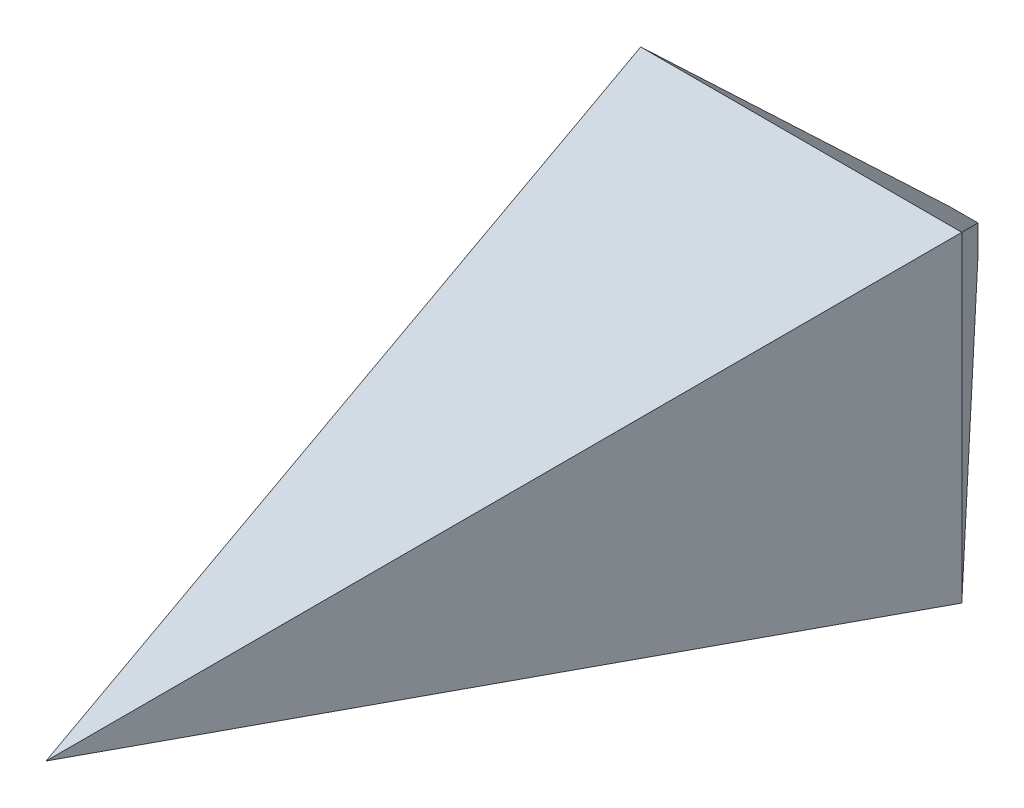
ISO-10303-21;
HEADER;
FILE_DESCRIPTION(('STEP AP214'),'2;1');
FILE_NAME('part.step','',(''),(''),'','','');
FILE_SCHEMA(('AUTOMOTIVE_DESIGN { 1 0 10303 214 1 1 1 1 }'));
ENDSEC;
DATA;
#1=APPLICATION_CONTEXT('core data for automotive mechanical design processes');
#2=APPLICATION_PROTOCOL_DEFINITION('international standard','automotive_design',2000,#1);
#3=PRODUCT_CONTEXT('',#1,'mechanical');
#4=PRODUCT('Part','Part','',(#3));
#5=PRODUCT_RELATED_PRODUCT_CATEGORY('part','',(#4));
#6=PRODUCT_DEFINITION_FORMATION('','',#4);
#7=PRODUCT_DEFINITION_CONTEXT('part definition',#1,'design');
#8=PRODUCT_DEFINITION('design','',#6,#7);
#9=PRODUCT_DEFINITION_SHAPE('','',#8);
#10=(LENGTH_UNIT() NAMED_UNIT(*) SI_UNIT(.MILLI.,.METRE.));
#11=(NAMED_UNIT(*) PLANE_ANGLE_UNIT() SI_UNIT($,.RADIAN.));
#12=(NAMED_UNIT(*) SI_UNIT($,.STERADIAN.) SOLID_ANGLE_UNIT());
#13=UNCERTAINTY_MEASURE_WITH_UNIT(LENGTH_MEASURE(1.E-05),#10,'distance_accuracy_value','');
#14=(GEOMETRIC_REPRESENTATION_CONTEXT(3) GLOBAL_UNCERTAINTY_ASSIGNED_CONTEXT((#13)) GLOBAL_UNIT_ASSIGNED_CONTEXT((#10,
#11,#12)) REPRESENTATION_CONTEXT('',''));
#15=CARTESIAN_POINT('',(0.,0.,0.));
#16=DIRECTION('',(0.,0.,1.));
#17=DIRECTION('',(1.,0.,0.));
#18=AXIS2_PLACEMENT_3D('',#15,#16,#17);
#19=CARTESIAN_POINT('',(37.5,37.5,0.));
#20=DIRECTION('',(0.978147600733806,0.,0.20791169081776));
#21=DIRECTION('',(0.20791169081776,0.,-0.978147600733806));
#22=AXIS2_PLACEMENT_3D('',#19,#20,#21);
#23=PLANE('',#22);
#24=DIRECTION('',(0.203558594952779,0.203558594952779,-0.957667894857973));
#25=VECTOR('',#24,1.);
#26=CARTESIAN_POINT('',(37.5,37.5,0.));
#27=LINE('',#26,#25);
#28=CARTESIAN_POINT('',(0.,0.,176.423629105442));
#29=VERTEX_POINT('',#28);
#30=CARTESIAN_POINT('',(37.5,37.5,0.));
#31=VERTEX_POINT('',#30);
#32=EDGE_CURVE('E11',#29,#31,#27,.T.);
#33=ORIENTED_EDGE('',*,*,#32,.F.);
#34=DIRECTION('',(0.203558594952779,-0.203558594952779,-0.957667894857973));
#35=VECTOR('',#34,1.);
#36=CARTESIAN_POINT('',(34.3922923815638,-34.3922923815638,14.6206148331506));
#37=LINE('',#36,#35);
#38=CARTESIAN_POINT('',(37.5,-37.5,0.));
#39=VERTEX_POINT('',#38);
#40=EDGE_CURVE('E97',#29,#39,#37,.T.);
#41=ORIENTED_EDGE('',*,*,#40,.T.);
#42=DIRECTION('',(0.,1.,0.));
#43=VECTOR('',#42,1.);
#44=CARTESIAN_POINT('',(37.5,37.5,0.));
#45=LINE('',#44,#43);
#46=EDGE_CURVE('E107',#39,#31,#45,.T.);
#47=ORIENTED_EDGE('',*,*,#46,.T.);
#48=EDGE_LOOP('',(#33,#41,#47));
#49=FACE_BOUND('',#48,.T.);
#50=ADVANCED_FACE('F36',(#49),#23,.T.);
#51=CARTESIAN_POINT('',(37.5,37.5,0.));
#52=DIRECTION('',(0.,0.978147600733806,0.20791169081776));
#53=DIRECTION('',(0.,-0.20791169081776,0.978147600733806));
#54=AXIS2_PLACEMENT_3D('',#51,#52,#53);
#55=PLANE('',#54);
#56=DIRECTION('',(-0.203558594952779,0.203558594952779,-0.957667894857973));
#57=VECTOR('',#56,1.);
#58=CARTESIAN_POINT('',(-37.5,37.5,0.));
#59=LINE('',#58,#57);
#60=CARTESIAN_POINT('',(-37.5,37.5,0.));
#61=VERTEX_POINT('',#60);
#62=EDGE_CURVE('E40',#29,#61,#59,.T.);
#63=ORIENTED_EDGE('',*,*,#62,.F.);
#64=ORIENTED_EDGE('',*,*,#32,.T.);
#65=DIRECTION('',(-1.,0.,0.));
#66=VECTOR('',#65,1.);
#67=CARTESIAN_POINT('',(37.5,37.5,0.));
#68=LINE('',#67,#66);
#69=EDGE_CURVE('E105',#31,#61,#68,.T.);
#70=ORIENTED_EDGE('',*,*,#69,.T.);
#71=EDGE_LOOP('',(#63,#64,#70));
#72=FACE_BOUND('',#71,.T.);
#73=ADVANCED_FACE('F38',(#72),#55,.T.);
#74=CARTESIAN_POINT('',(-37.5,37.5,0.));
#75=DIRECTION('',(-0.978147600733806,0.,0.20791169081776));
#76=DIRECTION('',(0.20791169081776,0.,0.978147600733806));
#77=AXIS2_PLACEMENT_3D('',#74,#75,#76);
#78=PLANE('',#77);
#79=DIRECTION('',(-0.203558594952779,-0.203558594952779,-0.957667894857973));
#80=VECTOR('',#79,1.);
#81=CARTESIAN_POINT('',(-34.3922923815638,-34.3922923815638,14.6206148331506));
#82=LINE('',#81,#80);
#83=CARTESIAN_POINT('',(-37.5,-37.5,0.));
#84=VERTEX_POINT('',#83);
#85=EDGE_CURVE('E99',#29,#84,#82,.T.);
#86=ORIENTED_EDGE('',*,*,#85,.F.);
#87=ORIENTED_EDGE('',*,*,#62,.T.);
#88=DIRECTION('',(0.,-1.,0.));
#89=VECTOR('',#88,1.);
#90=CARTESIAN_POINT('',(-37.5,37.5,0.));
#91=LINE('',#90,#89);
#92=EDGE_CURVE('E58',#61,#84,#91,.T.);
#93=ORIENTED_EDGE('',*,*,#92,.T.);
#94=EDGE_LOOP('',(#86,#87,#93));
#95=FACE_BOUND('',#94,.T.);
#96=ADVANCED_FACE('F104',(#95),#78,.T.);
#97=CARTESIAN_POINT('',(37.5,-37.5,0.));
#98=DIRECTION('',(0.,-0.978147600733806,0.20791169081776));
#99=DIRECTION('',(0.,-0.20791169081776,-0.978147600733806));
#100=AXIS2_PLACEMENT_3D('',#97,#98,#99);
#101=PLANE('',#100);
#102=ORIENTED_EDGE('',*,*,#40,.F.);
#103=ORIENTED_EDGE('',*,*,#85,.T.);
#104=DIRECTION('',(1.,0.,0.));
#105=VECTOR('',#104,1.);
#106=CARTESIAN_POINT('',(37.5,-37.5,0.));
#107=LINE('',#106,#105);
#108=EDGE_CURVE('E91',#84,#39,#107,.T.);
#109=ORIENTED_EDGE('',*,*,#108,.T.);
#110=EDGE_LOOP('',(#102,#103,#109));
#111=FACE_BOUND('',#110,.T.);
#112=ADVANCED_FACE('F100',(#111),#101,.T.);
#113=CARTESIAN_POINT('',(37.5,37.5,0.));
#114=DIRECTION('',(0.,0.743144825477393,-0.669130606358859));
#115=DIRECTION('',(0.,0.669130606358859,0.743144825477394));
#116=AXIS2_PLACEMENT_3D('',#113,#114,#115);
#117=PLANE('',#116);
#118=ORIENTED_EDGE('',*,*,#69,.F.);
#119=DIRECTION('',(0.556117091816005,0.556117091816005,0.617630601881269));
#120=VECTOR('',#119,1.);
#121=CARTESIAN_POINT('',(14.3050335142582,14.3050335142582,-25.7606200601085));
#122=LINE('',#121,#120);
#123=CARTESIAN_POINT('',(3.28464631668198,3.28464631668198,-38.));
#124=VERTEX_POINT('',#123);
#125=EDGE_CURVE('E117',#124,#31,#122,.T.);
#126=ORIENTED_EDGE('',*,*,#125,.F.);
#127=DIRECTION('',(-1.,0.,0.));
#128=VECTOR('',#127,1.);
#129=CARTESIAN_POINT('',(37.5,3.28464631668199,-38.));
#130=LINE('',#129,#128);
#131=CARTESIAN_POINT('',(-3.28464631668201,3.28464631668197,-38.));
#132=VERTEX_POINT('',#131);
#133=EDGE_CURVE('E119',#124,#132,#130,.T.);
#134=ORIENTED_EDGE('',*,*,#133,.T.);
#135=DIRECTION('',(-0.556117091816005,0.556117091816005,0.617630601881269));
#136=VECTOR('',#135,1.);
#137=CARTESIAN_POINT('',(-14.3050335142582,14.3050335142582,-25.7606200601085));
#138=LINE('',#137,#136);
#139=EDGE_CURVE('E88',#132,#61,#138,.T.);
#140=ORIENTED_EDGE('',*,*,#139,.T.);
#141=EDGE_LOOP('',(#118,#126,#134,#140));
#142=FACE_BOUND('',#141,.T.);
#143=ADVANCED_FACE('F115',(#142),#117,.T.);
#144=CARTESIAN_POINT('',(37.5,-37.5,0.));
#145=DIRECTION('',(0.743144825477393,0.,-0.669130606358859));
#146=DIRECTION('',(-0.669130606358859,0.,-0.743144825477394));
#147=AXIS2_PLACEMENT_3D('',#144,#145,#146);
#148=PLANE('',#147);
#149=ORIENTED_EDGE('',*,*,#46,.F.);
#150=DIRECTION('',(0.556117091816005,-0.556117091816005,0.617630601881269));
#151=VECTOR('',#150,1.);
#152=CARTESIAN_POINT('',(14.3050335142582,-14.3050335142582,-25.7606200601085));
#153=LINE('',#152,#151);
#154=CARTESIAN_POINT('',(3.28464631668199,-3.284646316682,-38.));
#155=VERTEX_POINT('',#154);
#156=EDGE_CURVE('E87',#155,#39,#153,.T.);
#157=ORIENTED_EDGE('',*,*,#156,.F.);
#158=DIRECTION('',(0.,1.,0.));
#159=VECTOR('',#158,1.);
#160=CARTESIAN_POINT('',(3.284646316682,-37.5,-38.));
#161=LINE('',#160,#159);
#162=EDGE_CURVE('E120',#155,#124,#161,.T.);
#163=ORIENTED_EDGE('',*,*,#162,.T.);
#164=ORIENTED_EDGE('',*,*,#125,.T.);
#165=EDGE_LOOP('',(#149,#157,#163,#164));
#166=FACE_BOUND('',#165,.T.);
#167=ADVANCED_FACE('F131',(#166),#148,.T.);
#168=CARTESIAN_POINT('',(-37.5,-37.5,0.));
#169=DIRECTION('',(0.,-0.743144825477393,-0.669130606358859));
#170=DIRECTION('',(0.,0.669130606358859,-0.743144825477394));
#171=AXIS2_PLACEMENT_3D('',#168,#169,#170);
#172=PLANE('',#171);
#173=ORIENTED_EDGE('',*,*,#108,.F.);
#174=DIRECTION('',(-0.556117091816005,-0.556117091816005,0.617630601881269));
#175=VECTOR('',#174,1.);
#176=CARTESIAN_POINT('',(-14.3050335142582,-14.3050335142582,-25.7606200601085));
#177=LINE('',#176,#175);
#178=CARTESIAN_POINT('',(-3.28464631668201,-3.284646316682,-38.));
#179=VERTEX_POINT('',#178);
#180=EDGE_CURVE('E79',#179,#84,#177,.T.);
#181=ORIENTED_EDGE('',*,*,#180,.F.);
#182=DIRECTION('',(1.,0.,0.));
#183=VECTOR('',#182,1.);
#184=CARTESIAN_POINT('',(-37.5,-3.28464631668201,-38.));
#185=LINE('',#184,#183);
#186=EDGE_CURVE('E123',#179,#155,#185,.T.);
#187=ORIENTED_EDGE('',*,*,#186,.T.);
#188=ORIENTED_EDGE('',*,*,#156,.T.);
#189=EDGE_LOOP('',(#173,#181,#187,#188));
#190=FACE_BOUND('',#189,.T.);
#191=ADVANCED_FACE('F93',(#190),#172,.T.);
#192=CARTESIAN_POINT('',(-37.5,37.5,0.));
#193=DIRECTION('',(-0.743144825477393,0.,-0.669130606358859));
#194=DIRECTION('',(-0.669130606358859,0.,0.743144825477394));
#195=AXIS2_PLACEMENT_3D('',#192,#193,#194);
#196=PLANE('',#195);
#197=ORIENTED_EDGE('',*,*,#92,.F.);
#198=ORIENTED_EDGE('',*,*,#139,.F.);
#199=DIRECTION('',(0.,-1.,0.));
#200=VECTOR('',#199,1.);
#201=CARTESIAN_POINT('',(-3.28464631668202,37.5,-38.));
#202=LINE('',#201,#200);
#203=EDGE_CURVE('E83',#132,#179,#202,.T.);
#204=ORIENTED_EDGE('',*,*,#203,.T.);
#205=ORIENTED_EDGE('',*,*,#180,.T.);
#206=EDGE_LOOP('',(#197,#198,#204,#205));
#207=FACE_BOUND('',#206,.T.);
#208=ADVANCED_FACE('F81',(#207),#196,.T.);
#209=CARTESIAN_POINT('',(37.5,37.5,-38.));
#210=DIRECTION('',(0.,0.,-1.));
#211=DIRECTION('',(-1.,0.,0.));
#212=AXIS2_PLACEMENT_3D('',#209,#210,#211);
#213=PLANE('',#212);
#214=ORIENTED_EDGE('',*,*,#133,.F.);
#215=ORIENTED_EDGE('',*,*,#162,.F.);
#216=ORIENTED_EDGE('',*,*,#186,.F.);
#217=ORIENTED_EDGE('',*,*,#203,.F.);
#218=EDGE_LOOP('',(#214,#215,#216,#217));
#219=FACE_BOUND('',#218,.T.);
#220=ADVANCED_FACE('F134',(#219),#213,.T.);
#221=CLOSED_SHELL('',(#50,#73,#96,#112,#143,#167,#191,#208,#220));
#222=MANIFOLD_SOLID_BREP('B2',#221);
#223=ADVANCED_BREP_SHAPE_REPRESENTATION('',(#18,#222),#14);
#224=SHAPE_DEFINITION_REPRESENTATION(#9,#223);
ENDSEC;
END-ISO-10303-21;
